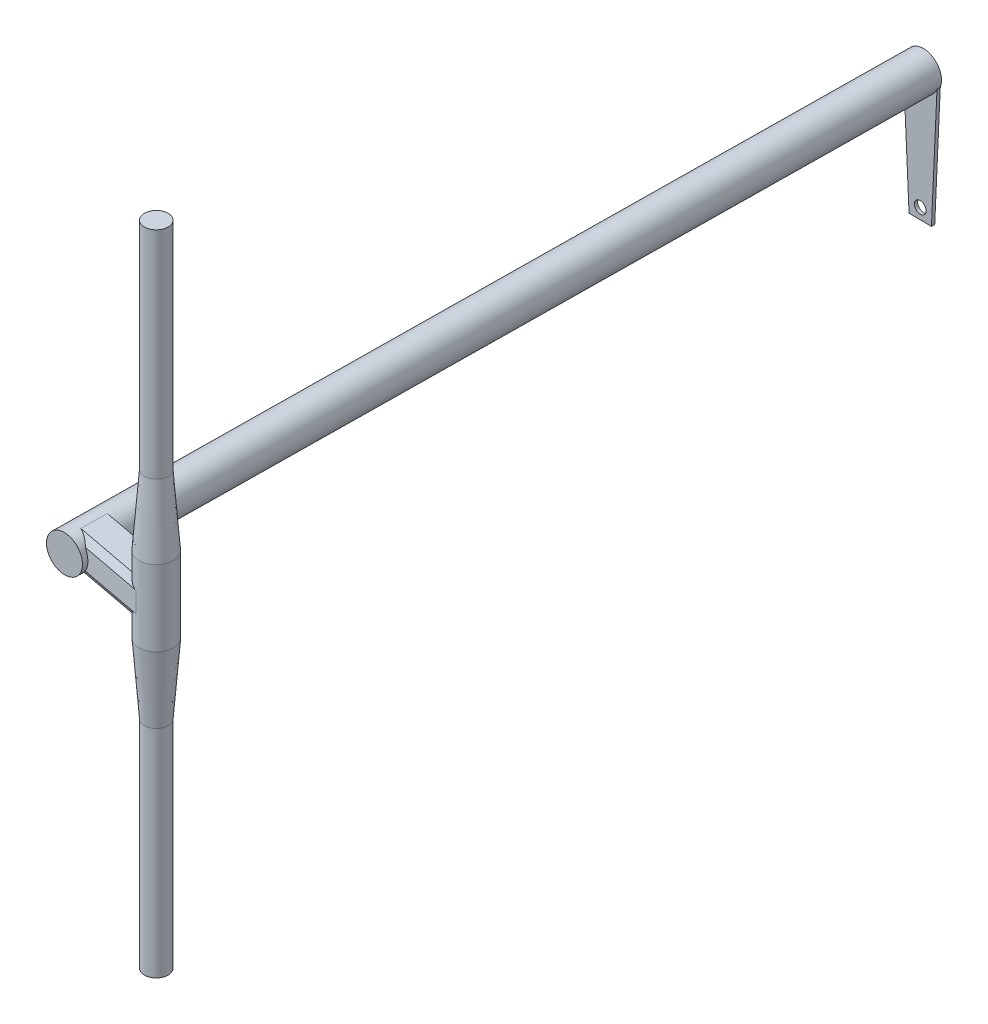
ISO-10303-21;
HEADER;
FILE_DESCRIPTION(('STEP AP214'),'2;1');
FILE_NAME('part.step','',(''),(''),'','','');
FILE_SCHEMA(('AUTOMOTIVE_DESIGN { 1 0 10303 214 1 1 1 1 }'));
ENDSEC;
DATA;
#1=APPLICATION_CONTEXT('core data for automotive mechanical design processes');
#2=APPLICATION_PROTOCOL_DEFINITION('international standard','automotive_design',2000,#1);
#3=PRODUCT_CONTEXT('',#1,'mechanical');
#4=PRODUCT('Part','Part','',(#3));
#5=PRODUCT_RELATED_PRODUCT_CATEGORY('part','',(#4));
#6=PRODUCT_DEFINITION_FORMATION('','',#4);
#7=PRODUCT_DEFINITION_CONTEXT('part definition',#1,'design');
#8=PRODUCT_DEFINITION('design','',#6,#7);
#9=PRODUCT_DEFINITION_SHAPE('','',#8);
#10=(LENGTH_UNIT() NAMED_UNIT(*) SI_UNIT(.MILLI.,.METRE.));
#11=(NAMED_UNIT(*) PLANE_ANGLE_UNIT() SI_UNIT($,.RADIAN.));
#12=(NAMED_UNIT(*) SI_UNIT($,.STERADIAN.) SOLID_ANGLE_UNIT());
#13=UNCERTAINTY_MEASURE_WITH_UNIT(LENGTH_MEASURE(1.E-05),#10,'distance_accuracy_value','');
#14=(GEOMETRIC_REPRESENTATION_CONTEXT(3) GLOBAL_UNCERTAINTY_ASSIGNED_CONTEXT((#13)) GLOBAL_UNIT_ASSIGNED_CONTEXT((#10,
#11,#12)) REPRESENTATION_CONTEXT('',''));
#15=CARTESIAN_POINT('',(0.,0.,0.));
#16=DIRECTION('',(0.,0.,1.));
#17=DIRECTION('',(1.,0.,0.));
#18=AXIS2_PLACEMENT_3D('',#15,#16,#17);
#19=CARTESIAN_POINT('',(-8.79567230162609,0.,724.946643656457));
#20=DIRECTION('',(0.0121319617953464,0.,-0.999926405043389));
#21=DIRECTION('',(-0.999926405043389,0.,-0.0121319617953465));
#22=AXIS2_PLACEMENT_3D('',#19,#20,#21);
#23=CYLINDRICAL_SURFACE('',#22,16.9);
#24=CARTESIAN_POINT('',(0.740049669516222,0.,-60.9955107076468));
#25=DIRECTION('',(0.0121319617953463,0.,-0.999926405043389));
#26=DIRECTION('',(-0.999926405043389,0.,-0.0121319617953463));
#27=AXIS2_PLACEMENT_3D('',#24,#25,#26);
#28=CIRCLE('',#27,16.9);
#29=CARTESIAN_POINT('',(-14.9711540024849,-6.22348315051543,-61.1861324591539));
#30=VERTEX_POINT('',#29);
#31=CARTESIAN_POINT('',(16.4512533415172,-6.22348315051599,-60.8048889561396));
#32=VERTEX_POINT('',#31);
#33=EDGE_CURVE('E218',#30,#32,#28,.T.);
#34=ORIENTED_EDGE('',*,*,#33,.F.);
#35=DIRECTION('',(0.0121319617953464,0.,-0.999926405043389));
#36=VECTOR('',#35,1.);
#37=CARTESIAN_POINT('',(-24.5068759736271,-6.22348315051575,724.75602190495));
#38=LINE('',#37,#36);
#39=CARTESIAN_POINT('',(-15.007549887871,-6.22348315051544,-58.1863532440237));
#40=VERTEX_POINT('',#39);
#41=EDGE_CURVE('E184',#30,#40,#38,.F.);
#42=ORIENTED_EDGE('',*,*,#41,.T.);
#43=CARTESIAN_POINT('',(0.703653784130183,0.,-57.9957314925166));
#44=DIRECTION('',(0.0121319617953463,0.,-0.999926405043389));
#45=DIRECTION('',(-0.999926405043389,0.,-0.0121319617953464));
#46=AXIS2_PLACEMENT_3D('',#43,#44,#45);
#47=CIRCLE('',#46,16.9);
#48=CARTESIAN_POINT('',(16.4148574561311,-6.223483150516,-57.8051097410094));
#49=VERTEX_POINT('',#48);
#50=EDGE_CURVE('E233',#49,#40,#47,.T.);
#51=ORIENTED_EDGE('',*,*,#50,.F.);
#52=DIRECTION('',(0.0121319617953464,0.,-0.999926405043389));
#53=VECTOR('',#52,1.);
#54=CARTESIAN_POINT('',(6.91553137037498,-6.22348315051569,725.137265407964));
#55=LINE('',#54,#53);
#56=EDGE_CURVE('E155',#49,#32,#55,.T.);
#57=ORIENTED_EDGE('',*,*,#56,.T.);
#58=EDGE_LOOP('',(#34,#42,#51,#57));
#59=FACE_BOUND('',#58,.T.);
#60=DIRECTION('',(0.0121319617953464,0.,-0.999926405043389));
#61=VECTOR('',#60,1.);
#62=CARTESIAN_POINT('',(-5.14080792450899,16.5,724.990987594938));
#63=LINE('',#62,#61);
#64=CARTESIAN_POINT('',(-5.00342810130972,16.5,713.668028039474));
#65=VERTEX_POINT('',#64);
#66=CARTESIAN_POINT('',(-4.708790597851,16.5,689.38375937837));
#67=VERTEX_POINT('',#66);
#68=EDGE_CURVE('E224',#65,#67,#63,.T.);
#69=ORIENTED_EDGE('',*,*,#68,.T.);
#70=CARTESIAN_POINT('',(-8.23848059248754,0.,679.022438483589));
#71=DIRECTION('',(-0.16071963414222,-0.500000000000007,0.850981315424248));
#72=DIRECTION('',(-0.239292476715524,-0.816727178648459,-0.525067449233219));
#73=AXIS2_PLACEMENT_3D('',#70,#71,#72);
#74=ELLIPSE('',#73,19.8154807767517,16.9);
#75=CARTESIAN_POINT('',(5.64014694284135,9.50000000000011,687.22540112607));
#76=VERTEX_POINT('',#75);
#77=EDGE_CURVE('E254',#67,#76,#74,.F.);
#78=ORIENTED_EDGE('',*,*,#77,.T.);
#79=CARTESIAN_POINT('',(-8.30604882413043,0.,684.591468464192));
#80=DIRECTION('',(0.185583048072138,0.,-0.982628583071068));
#81=DIRECTION('',(-0.982628583071068,0.,-0.185583048072138));
#82=AXIS2_PLACEMENT_3D('',#79,#80,#81);
#83=ELLIPSE('',#82,17.1607097408691,16.9);
#84=CARTESIAN_POINT('',(5.64014694284137,-9.50000000000009,687.22540112607));
#85=VERTEX_POINT('',#84);
#86=EDGE_CURVE('E221',#76,#85,#83,.T.);
#87=ORIENTED_EDGE('',*,*,#86,.T.);
#88=CARTESIAN_POINT('',(-8.23848059248754,0.,679.022438483589));
#89=DIRECTION('',(-0.16071963414222,0.500000000000007,0.850981315424248));
#90=DIRECTION('',(-0.239292476715524,0.816727178648459,-0.525067449233219));
#91=AXIS2_PLACEMENT_3D('',#88,#89,#90);
#92=ELLIPSE('',#91,19.8154807767517,16.9);
#93=CARTESIAN_POINT('',(-4.70879059785085,-16.5,689.38375937837));
#94=VERTEX_POINT('',#93);
#95=EDGE_CURVE('E258',#85,#94,#92,.F.);
#96=ORIENTED_EDGE('',*,*,#95,.T.);
#97=DIRECTION('',(0.0121319617953464,0.,-0.999926405043389));
#98=VECTOR('',#97,1.);
#99=CARTESIAN_POINT('',(-5.14080792450884,-16.5,724.990987594938));
#100=LINE('',#99,#98);
#101=CARTESIAN_POINT('',(-5.00342810130957,-16.5,713.668028039474));
#102=VERTEX_POINT('',#101);
#103=EDGE_CURVE('E230',#94,#102,#100,.F.);
#104=ORIENTED_EDGE('',*,*,#103,.T.);
#105=CARTESIAN_POINT('',(-8.76782879533736,0.,722.651758656262));
#106=DIRECTION('',(0.16071963414222,0.500000000000004,-0.85098131542425));
#107=DIRECTION('',(-0.239292476715526,-0.81672717864846,-0.525067449233216));
#108=AXIS2_PLACEMENT_3D('',#105,#106,#107);
#109=ELLIPSE('',#108,19.8154807767517,16.9);
#110=CARTESIAN_POINT('',(5.24593520327712,-9.50000000000042,719.716661337536));
#111=VERTEX_POINT('',#110);
#112=EDGE_CURVE('E67',#102,#111,#109,.F.);
#113=ORIENTED_EDGE('',*,*,#112,.T.);
#114=CARTESIAN_POINT('',(-8.70026056369447,0.,717.082728675658));
#115=DIRECTION('',(-0.185583048072138,0.,0.982628583071068));
#116=DIRECTION('',(-0.982628583071068,0.,-0.185583048072138));
#117=AXIS2_PLACEMENT_3D('',#114,#115,#116);
#118=ELLIPSE('',#117,17.1607097408691,16.9);
#119=CARTESIAN_POINT('',(5.24593520327709,9.50000000000046,719.716661337536));
#120=VERTEX_POINT('',#119);
#121=EDGE_CURVE('E227',#111,#120,#118,.T.);
#122=ORIENTED_EDGE('',*,*,#121,.T.);
#123=CARTESIAN_POINT('',(-8.76782879533736,0.,722.651758656262));
#124=DIRECTION('',(0.16071963414222,-0.500000000000004,-0.85098131542425));
#125=DIRECTION('',(-0.239292476715526,0.81672717864846,-0.525067449233216));
#126=AXIS2_PLACEMENT_3D('',#123,#124,#125);
#127=ELLIPSE('',#126,19.8154807767517,16.9);
#128=EDGE_CURVE('E262',#120,#65,#127,.F.);
#129=ORIENTED_EDGE('',*,*,#128,.T.);
#130=EDGE_LOOP('',(#69,#78,#87,#96,#104,#113,#122,#129));
#131=FACE_BOUND('',#130,.T.);
#132=CARTESIAN_POINT('',(-8.79567230162609,0.,724.946643656457));
#133=DIRECTION('',(-0.0121319617953462,0.,0.999926405043389));
#134=DIRECTION('',(0.999926405043389,0.,0.0121319617953462));
#135=AXIS2_PLACEMENT_3D('',#132,#133,#134);
#136=CIRCLE('',#135,16.9);
#137=CARTESIAN_POINT('',(8.1030839436072,0.,725.151673810799));
#138=VERTEX_POINT('',#137);
#139=EDGE_CURVE('E213',#138,#138,#136,.T.);
#140=ORIENTED_EDGE('',*,*,#139,.F.);
#141=EDGE_LOOP('',(#140));
#142=FACE_BOUND('',#141,.T.);
#143=ADVANCED_FACE('F58',(#59,#131,#142),#23,.T.);
#144=CARTESIAN_POINT('',(-8.79567230172777,-4.28049522910312E-12,724.946643656456));
#145=DIRECTION('',(0.0121319617954866,0.,-0.999926405043388));
#146=DIRECTION('',(-0.999926405043388,0.,-0.0121319617954866));
#147=AXIS2_PLACEMENT_3D('',#144,#145,#146);
#148=PLANE('',#147);
#149=ORIENTED_EDGE('',*,*,#139,.T.);
#150=EDGE_LOOP('',(#149));
#151=FACE_BOUND('',#150,.T.);
#152=ADVANCED_FACE('F305',(#151),#148,.F.);
#153=CARTESIAN_POINT('',(0.740049669516125,0.,-60.9955107076468));
#154=DIRECTION('',(0.0121319617953463,0.,-0.999926405043389));
#155=DIRECTION('',(-0.999926405043389,0.,-0.0121319617953463));
#156=AXIS2_PLACEMENT_3D('',#153,#154,#155);
#157=PLANE('',#156);
#158=ORIENTED_EDGE('',*,*,#33,.T.);
#159=DIRECTION('',(-0.0461658037438821,-0.998933633845071,-0.00056012298949935));
#160=VECTOR('',#159,1.);
#161=CARTESIAN_POINT('',(16.7388721502104,0.,-60.8013993189212));
#162=LINE('',#161,#160);
#163=CARTESIAN_POINT('',(11.2392769224717,-119.,-60.8681251087956));
#164=VERTEX_POINT('',#163);
#165=EDGE_CURVE('E177',#32,#164,#162,.T.);
#166=ORIENTED_EDGE('',*,*,#165,.T.);
#167=DIRECTION('',(-0.999926405043389,0.,-0.0121319617953463));
#168=VECTOR('',#167,1.);
#169=CARTESIAN_POINT('',(11.2392769224717,-119.,-60.8681251087956));
#170=LINE('',#169,#168);
#171=CARTESIAN_POINT('',(-9.75917758343947,-119.,-61.1228963064979));
#172=VERTEX_POINT('',#171);
#173=EDGE_CURVE('E167',#164,#172,#170,.T.);
#174=ORIENTED_EDGE('',*,*,#173,.T.);
#175=DIRECTION('',(-0.0461658037438821,0.998933633845071,-0.00056012298949935));
#176=VECTOR('',#175,1.);
#177=CARTESIAN_POINT('',(-9.75917758343947,-119.,-61.1228963064979));
#178=LINE('',#177,#176);
#179=EDGE_CURVE('E160',#172,#30,#178,.T.);
#180=ORIENTED_EDGE('',*,*,#179,.T.);
#181=EDGE_LOOP('',(#158,#166,#174,#180));
#182=FACE_BOUND('',#181,.T.);
#183=CARTESIAN_POINT('',(0.740049669516024,-109.,-60.9955107076468));
#184=DIRECTION('',(0.0121319617953463,0.,-0.999926405043389));
#185=DIRECTION('',(0.,1.,0.));
#186=AXIS2_PLACEMENT_3D('',#183,#184,#185);
#187=ELLIPSE('',#186,5.50000000000001,5.49959522773864);
#188=CARTESIAN_POINT('',(0.740049669516024,-103.5,-60.9955107076468));
#189=VERTEX_POINT('',#188);
#190=EDGE_CURVE('E350',#189,#189,#187,.T.);
#191=ORIENTED_EDGE('',*,*,#190,.F.);
#192=EDGE_LOOP('',(#191));
#193=FACE_BOUND('',#192,.T.);
#194=ADVANCED_FACE('F313',(#182,#193),#157,.T.);
#195=CARTESIAN_POINT('',(81.6028370847578,-16.5,734.137722190684));
#196=DIRECTION('',(0.,-1.,0.));
#197=DIRECTION('',(0.,0.,-1.));
#198=AXIS2_PLACEMENT_3D('',#195,#196,#197);
#199=PLANE('',#198);
#200=ORIENTED_EDGE('',*,*,#103,.F.);
#201=DIRECTION('',(0.982628583071068,0.,0.185583048072138));
#202=VECTOR('',#201,1.);
#203=CARTESIAN_POINT('',(86.7914696637359,-16.5,706.664853671056));
#204=LINE('',#203,#202);
#205=CARTESIAN_POINT('',(57.9784640597501,-16.5,701.223117600856));
#206=VERTEX_POINT('',#205);
#207=EDGE_CURVE('E248',#94,#206,#204,.T.);
#208=ORIENTED_EDGE('',*,*,#207,.T.);
#209=CARTESIAN_POINT('',(66.2043276983739,-16.5,714.946643656457));
#210=DIRECTION('',(0.,-1.,0.));
#211=DIRECTION('',(0.,0.,-1.));
#212=AXIS2_PLACEMENT_3D('',#209,#210,#211);
#213=CIRCLE('',#212,16.);
#214=CARTESIAN_POINT('',(53.5398564401023,-16.5,724.724739981837));
#215=VERTEX_POINT('',#214);
#216=EDGE_CURVE('E205',#215,#206,#213,.T.);
#217=ORIENTED_EDGE('',*,*,#216,.F.);
#218=DIRECTION('',(-0.982628583071068,0.,-0.185583048072138));
#219=VECTOR('',#218,1.);
#220=CARTESIAN_POINT('',(82.3528620440881,-16.5,730.166476052037));
#221=LINE('',#220,#219);
#222=EDGE_CURVE('E245',#215,#102,#221,.T.);
#223=ORIENTED_EDGE('',*,*,#222,.T.);
#224=EDGE_LOOP('',(#200,#208,#217,#223));
#225=FACE_BOUND('',#224,.T.);
#226=ADVANCED_FACE('F276',(#225),#199,.T.);
#227=CARTESIAN_POINT('',(81.6028370847578,16.5,734.137722190684));
#228=DIRECTION('',(0.,1.,0.));
#229=DIRECTION('',(0.,0.,1.));
#230=AXIS2_PLACEMENT_3D('',#227,#228,#229);
#231=PLANE('',#230);
#232=CARTESIAN_POINT('',(66.2043276983739,16.5,714.946643656457));
#233=DIRECTION('',(0.,1.,0.));
#234=DIRECTION('',(0.,0.,1.));
#235=AXIS2_PLACEMENT_3D('',#232,#233,#234);
#236=CIRCLE('',#235,16.);
#237=CARTESIAN_POINT('',(57.9784640597501,16.5,701.223117600856));
#238=VERTEX_POINT('',#237);
#239=CARTESIAN_POINT('',(53.5398564401023,16.5,724.724739981837));
#240=VERTEX_POINT('',#239);
#241=EDGE_CURVE('E208',#238,#240,#236,.T.);
#242=ORIENTED_EDGE('',*,*,#241,.F.);
#243=DIRECTION('',(-0.982628583071068,0.,-0.185583048072138));
#244=VECTOR('',#243,1.);
#245=CARTESIAN_POINT('',(86.7914696637359,16.5,706.664853671056));
#246=LINE('',#245,#244);
#247=EDGE_CURVE('E237',#238,#67,#246,.T.);
#248=ORIENTED_EDGE('',*,*,#247,.T.);
#249=ORIENTED_EDGE('',*,*,#68,.F.);
#250=DIRECTION('',(0.982628583071068,0.,0.185583048072138));
#251=VECTOR('',#250,1.);
#252=CARTESIAN_POINT('',(82.3528620440881,16.5,730.166476052037));
#253=LINE('',#252,#251);
#254=EDGE_CURVE('E235',#65,#240,#253,.T.);
#255=ORIENTED_EDGE('',*,*,#254,.T.);
#256=EDGE_LOOP('',(#242,#248,#249,#255));
#257=FACE_BOUND('',#256,.T.);
#258=ADVANCED_FACE('F292',(#257),#231,.T.);
#259=CARTESIAN_POINT('',(81.6028370847578,16.5,734.137722190684));
#260=DIRECTION('',(-0.185583048072138,0.,0.982628583071068));
#261=DIRECTION('',(0.982628583071068,0.,0.185583048072138));
#262=AXIS2_PLACEMENT_3D('',#259,#260,#261);
#263=PLANE('',#262);
#264=DIRECTION('',(0.,1.,0.));
#265=VECTOR('',#264,1.);
#266=CARTESIAN_POINT('',(63.2349989292197,300.,730.668700985594));
#267=LINE('',#266,#265);
#268=CARTESIAN_POINT('',(63.2349989292197,-9.5000000000004,730.668700985594));
#269=VERTEX_POINT('',#268);
#270=CARTESIAN_POINT('',(63.2349989292197,9.50000000000045,730.668700985594));
#271=VERTEX_POINT('',#270);
#272=EDGE_CURVE('E206',#269,#271,#267,.T.);
#273=ORIENTED_EDGE('',*,*,#272,.T.);
#274=DIRECTION('',(-0.982628583071068,0.,-0.185583048072138));
#275=VECTOR('',#274,1.);
#276=CARTESIAN_POINT('',(81.6028370847578,9.50000000000046,734.137722190684));
#277=LINE('',#276,#275);
#278=EDGE_CURVE('E251',#271,#120,#277,.T.);
#279=ORIENTED_EDGE('',*,*,#278,.T.);
#280=ORIENTED_EDGE('',*,*,#121,.F.);
#281=DIRECTION('',(0.982628583071068,0.,0.185583048072138));
#282=VECTOR('',#281,1.);
#283=CARTESIAN_POINT('',(81.6028370847578,-9.50000000000042,734.137722190684));
#284=LINE('',#283,#282);
#285=EDGE_CURVE('E81',#111,#269,#284,.T.);
#286=ORIENTED_EDGE('',*,*,#285,.T.);
#287=EDGE_LOOP('',(#273,#279,#280,#286));
#288=FACE_BOUND('',#287,.T.);
#289=ADVANCED_FACE('F269',(#288),#263,.T.);
#290=CARTESIAN_POINT('',(87.5414946230662,16.5,702.693607532409));
#291=DIRECTION('',(0.185583048072138,0.,-0.982628583071068));
#292=DIRECTION('',(-0.982628583071068,0.,-0.185583048072138));
#293=AXIS2_PLACEMENT_3D('',#290,#291,#292);
#294=PLANE('',#293);
#295=ORIENTED_EDGE('',*,*,#86,.F.);
#296=DIRECTION('',(0.982628583071068,0.,0.185583048072138));
#297=VECTOR('',#296,1.);
#298=CARTESIAN_POINT('',(87.5414946230662,9.50000000000012,702.693607532409));
#299=LINE('',#298,#297);
#300=CARTESIAN_POINT('',(69.1736564675281,9.50000000000012,699.22458632732));
#301=VERTEX_POINT('',#300);
#302=EDGE_CURVE('E243',#76,#301,#299,.T.);
#303=ORIENTED_EDGE('',*,*,#302,.T.);
#304=DIRECTION('',(0.,1.,0.));
#305=VECTOR('',#304,1.);
#306=CARTESIAN_POINT('',(69.1736564675281,300.,699.22458632732));
#307=LINE('',#306,#305);
#308=CARTESIAN_POINT('',(69.1736564675281,-9.50000000000012,699.22458632732));
#309=VERTEX_POINT('',#308);
#310=EDGE_CURVE('E210',#309,#301,#307,.T.);
#311=ORIENTED_EDGE('',*,*,#310,.F.);
#312=DIRECTION('',(-0.982628583071068,0.,-0.185583048072138));
#313=VECTOR('',#312,1.);
#314=CARTESIAN_POINT('',(87.5414946230662,-9.5000000000001,702.693607532409));
#315=LINE('',#314,#313);
#316=EDGE_CURVE('E240',#309,#85,#315,.T.);
#317=ORIENTED_EDGE('',*,*,#316,.T.);
#318=EDGE_LOOP('',(#295,#303,#311,#317));
#319=FACE_BOUND('',#318,.T.);
#320=ADVANCED_FACE('F285',(#319),#294,.T.);
#321=CARTESIAN_POINT('',(66.2043276983739,300.,714.946643656457));
#322=DIRECTION('',(0.,1.,0.));
#323=DIRECTION('',(-1.,0.,0.));
#324=AXIS2_PLACEMENT_3D('',#321,#322,#323);
#325=CYLINDRICAL_SURFACE('',#324,16.);
#326=CARTESIAN_POINT('',(66.2043276983739,34.9999999999996,714.946643656457));
#327=DIRECTION('',(0.,1.,0.));
#328=DIRECTION('',(-1.,0.,0.));
#329=AXIS2_PLACEMENT_3D('',#326,#327,#328);
#330=CIRCLE('',#329,16.);
#331=CARTESIAN_POINT('',(50.2043276983738,34.9999999999996,714.946643656457));
#332=VERTEX_POINT('',#331);
#333=EDGE_CURVE('E193',#332,#332,#330,.T.);
#334=ORIENTED_EDGE('',*,*,#333,.F.);
#335=EDGE_LOOP('',(#334));
#336=FACE_BOUND('',#335,.T.);
#337=CARTESIAN_POINT('',(66.2043276983739,-34.9999999999996,714.946643656457));
#338=DIRECTION('',(0.,1.,0.));
#339=DIRECTION('',(-1.,0.,0.));
#340=AXIS2_PLACEMENT_3D('',#337,#338,#339);
#341=CIRCLE('',#340,15.9999999999999);
#342=CARTESIAN_POINT('',(50.2043276983739,-34.9999999999996,714.946643656457));
#343=VERTEX_POINT('',#342);
#344=EDGE_CURVE('E196',#343,#343,#341,.T.);
#345=ORIENTED_EDGE('',*,*,#344,.T.);
#346=EDGE_LOOP('',(#345));
#347=FACE_BOUND('',#346,.T.);
#348=ORIENTED_EDGE('',*,*,#272,.F.);
#349=CARTESIAN_POINT('',(66.2043276983739,-37.212812921102,714.946643656457));
#350=DIRECTION('',(0.16071963414222,0.500000000000004,-0.85098131542425));
#351=DIRECTION('',(-0.0927915240360698,0.866025403784437,0.491314291535538));
#352=AXIS2_PLACEMENT_3D('',#349,#350,#351);
#353=ELLIPSE('',#352,31.9999999999997,16.);
#354=EDGE_CURVE('E12',#269,#215,#353,.F.);
#355=ORIENTED_EDGE('',*,*,#354,.T.);
#356=ORIENTED_EDGE('',*,*,#216,.T.);
#357=CARTESIAN_POINT('',(66.2043276983739,-37.212812921102,714.946643656457));
#358=DIRECTION('',(-0.16071963414222,0.500000000000007,0.850981315424248));
#359=DIRECTION('',(0.0927915240360706,0.866025403784435,-0.491314291535541));
#360=AXIS2_PLACEMENT_3D('',#357,#358,#359);
#361=ELLIPSE('',#360,31.9999999999995,16.);
#362=EDGE_CURVE('E260',#206,#309,#361,.F.);
#363=ORIENTED_EDGE('',*,*,#362,.T.);
#364=ORIENTED_EDGE('',*,*,#310,.T.);
#365=CARTESIAN_POINT('',(66.2043276983739,37.2128129211019,714.946643656457));
#366=DIRECTION('',(-0.16071963414222,-0.500000000000007,0.850981315424248));
#367=DIRECTION('',(-0.0927915240360704,0.866025403784435,0.491314291535541));
#368=AXIS2_PLACEMENT_3D('',#365,#366,#367);
#369=ELLIPSE('',#368,31.9999999999995,16.);
#370=EDGE_CURVE('E256',#301,#238,#369,.F.);
#371=ORIENTED_EDGE('',*,*,#370,.T.);
#372=ORIENTED_EDGE('',*,*,#241,.T.);
#373=CARTESIAN_POINT('',(66.2043276983739,37.2128129211021,714.946643656457));
#374=DIRECTION('',(0.16071963414222,-0.500000000000004,-0.85098131542425));
#375=DIRECTION('',(0.09279152403607,0.866025403784437,-0.491314291535538));
#376=AXIS2_PLACEMENT_3D('',#373,#374,#375);
#377=ELLIPSE('',#376,31.9999999999997,16.);
#378=EDGE_CURVE('E74',#240,#271,#377,.F.);
#379=ORIENTED_EDGE('',*,*,#378,.T.);
#380=EDGE_LOOP('',(#348,#355,#356,#363,#364,#371,#372,#379));
#381=FACE_BOUND('',#380,.T.);
#382=ADVANCED_FACE('F273',(#336,#347,#381),#325,.T.);
#383=CARTESIAN_POINT('',(55.204327698374,300.,714.946643656457));
#384=DIRECTION('',(0.,1.,0.));
#385=DIRECTION('',(-1.,0.,0.));
#386=AXIS2_PLACEMENT_3D('',#383,#384,#385);
#387=PLANE('',#386);
#388=CARTESIAN_POINT('',(66.2043276983739,300.,714.946643656457));
#389=DIRECTION('',(0.,1.,0.));
#390=DIRECTION('',(-1.,0.,0.));
#391=AXIS2_PLACEMENT_3D('',#388,#389,#390);
#392=CIRCLE('',#391,10.9999999999999);
#393=CARTESIAN_POINT('',(55.204327698374,300.,714.946643656457));
#394=VERTEX_POINT('',#393);
#395=EDGE_CURVE('E187',#394,#394,#392,.T.);
#396=ORIENTED_EDGE('',*,*,#395,.T.);
#397=EDGE_LOOP('',(#396));
#398=FACE_BOUND('',#397,.T.);
#399=ADVANCED_FACE('F372',(#398),#387,.T.);
#400=CARTESIAN_POINT('',(66.2043276983738,-300.,714.946643656457));
#401=DIRECTION('',(0.,-1.,0.));
#402=DIRECTION('',(1.,0.,0.));
#403=AXIS2_PLACEMENT_3D('',#400,#401,#402);
#404=PLANE('',#403);
#405=CARTESIAN_POINT('',(66.2043276983738,-300.,714.946643656457));
#406=DIRECTION('',(0.,1.,0.));
#407=DIRECTION('',(-1.,0.,0.));
#408=AXIS2_PLACEMENT_3D('',#405,#406,#407);
#409=CIRCLE('',#408,11.);
#410=CARTESIAN_POINT('',(55.2043276983738,-300.,714.946643656457));
#411=VERTEX_POINT('',#410);
#412=EDGE_CURVE('E202',#411,#411,#409,.T.);
#413=ORIENTED_EDGE('',*,*,#412,.F.);
#414=EDGE_LOOP('',(#413));
#415=FACE_BOUND('',#414,.T.);
#416=ADVANCED_FACE('F380',(#415),#404,.T.);
#417=CARTESIAN_POINT('',(66.2043276983739,300.,714.946643656457));
#418=DIRECTION('',(0.,1.,0.));
#419=DIRECTION('',(-1.,0.,0.));
#420=AXIS2_PLACEMENT_3D('',#417,#418,#419);
#421=CYLINDRICAL_SURFACE('',#420,11.);
#422=ORIENTED_EDGE('',*,*,#412,.T.);
#423=EDGE_LOOP('',(#422));
#424=FACE_BOUND('',#423,.T.);
#425=CARTESIAN_POINT('',(66.2043276983738,-100.,714.946643656457));
#426=DIRECTION('',(0.,1.,0.));
#427=DIRECTION('',(-1.,0.,0.));
#428=AXIS2_PLACEMENT_3D('',#425,#426,#427);
#429=CIRCLE('',#428,11.);
#430=CARTESIAN_POINT('',(55.2043276983738,-100.,714.946643656457));
#431=VERTEX_POINT('',#430);
#432=EDGE_CURVE('E199',#431,#431,#429,.T.);
#433=ORIENTED_EDGE('',*,*,#432,.F.);
#434=EDGE_LOOP('',(#433));
#435=FACE_BOUND('',#434,.T.);
#436=ADVANCED_FACE('F376',(#424,#435),#421,.T.);
#437=CARTESIAN_POINT('',(66.2043276983739,-34.9999999999996,714.946643656457));
#438=DIRECTION('',(0.,1.,0.));
#439=DIRECTION('',(-1.,0.,0.));
#440=AXIS2_PLACEMENT_3D('',#437,#438,#439);
#441=CONICAL_SURFACE('',#440,15.9999999999999,0.0767718912697761);
#442=ORIENTED_EDGE('',*,*,#432,.T.);
#443=EDGE_LOOP('',(#442));
#444=FACE_BOUND('',#443,.T.);
#445=ORIENTED_EDGE('',*,*,#344,.F.);
#446=EDGE_LOOP('',(#445));
#447=FACE_BOUND('',#446,.T.);
#448=ADVANCED_FACE('F369',(#444,#447),#441,.T.);
#449=CARTESIAN_POINT('',(66.2043276983739,100.,714.946643656457));
#450=DIRECTION('',(0.,-1.,0.));
#451=DIRECTION('',(1.,0.,0.));
#452=AXIS2_PLACEMENT_3D('',#449,#450,#451);
#453=CONICAL_SURFACE('',#452,10.9999999999999,0.0767718912697794);
#454=ORIENTED_EDGE('',*,*,#333,.T.);
#455=EDGE_LOOP('',(#454));
#456=FACE_BOUND('',#455,.T.);
#457=CARTESIAN_POINT('',(66.2043276983739,100.,714.946643656457));
#458=DIRECTION('',(0.,1.,0.));
#459=DIRECTION('',(-1.,0.,0.));
#460=AXIS2_PLACEMENT_3D('',#457,#458,#459);
#461=CIRCLE('',#460,10.9999999999999);
#462=CARTESIAN_POINT('',(55.204327698374,100.,714.946643656457));
#463=VERTEX_POINT('',#462);
#464=EDGE_CURVE('E190',#463,#463,#461,.T.);
#465=ORIENTED_EDGE('',*,*,#464,.F.);
#466=EDGE_LOOP('',(#465));
#467=FACE_BOUND('',#466,.T.);
#468=ADVANCED_FACE('F365',(#456,#467),#453,.T.);
#469=CARTESIAN_POINT('',(66.2043276983739,300.,714.946643656457));
#470=DIRECTION('',(0.,1.,0.));
#471=DIRECTION('',(-1.,0.,0.));
#472=AXIS2_PLACEMENT_3D('',#469,#470,#471);
#473=CYLINDRICAL_SURFACE('',#472,10.9999999999999);
#474=ORIENTED_EDGE('',*,*,#464,.T.);
#475=EDGE_LOOP('',(#474));
#476=FACE_BOUND('',#475,.T.);
#477=ORIENTED_EDGE('',*,*,#395,.F.);
#478=EDGE_LOOP('',(#477));
#479=FACE_BOUND('',#478,.T.);
#480=ADVANCED_FACE('F357',(#476,#479),#473,.T.);
#481=CARTESIAN_POINT('',(-9.7955734688255,-119.,-58.1231170913677));
#482=DIRECTION('',(-0.998860117367631,-0.046169201564268,-0.0121190246818949));
#483=DIRECTION('',(0.0461725923906261,-0.998933477120438,0.));
#484=AXIS2_PLACEMENT_3D('',#481,#482,#483);
#485=PLANE('',#484);
#486=ORIENTED_EDGE('',*,*,#41,.F.);
#487=ORIENTED_EDGE('',*,*,#179,.F.);
#488=DIRECTION('',(0.0121319617953463,0.,-0.999926405043389));
#489=VECTOR('',#488,1.);
#490=CARTESIAN_POINT('',(-9.7955734688255,-119.,-58.1231170913677));
#491=LINE('',#490,#489);
#492=CARTESIAN_POINT('',(-9.7955734688255,-119.,-58.1231170913677));
#493=VERTEX_POINT('',#492);
#494=EDGE_CURVE('E168',#493,#172,#491,.T.);
#495=ORIENTED_EDGE('',*,*,#494,.F.);
#496=DIRECTION('',(-0.0461658037438821,0.998933633845071,-0.00056012298949935));
#497=VECTOR('',#496,1.);
#498=CARTESIAN_POINT('',(-9.7955734688255,-119.,-58.1231170913677));
#499=LINE('',#498,#497);
#500=EDGE_CURVE('E169',#493,#40,#499,.T.);
#501=ORIENTED_EDGE('',*,*,#500,.T.);
#502=EDGE_LOOP('',(#486,#487,#495,#501));
#503=FACE_BOUND('',#502,.T.);
#504=ADVANCED_FACE('F354',(#503),#485,.T.);
#505=CARTESIAN_POINT('',(16.7024762648243,0.,-57.801620103791));
#506=DIRECTION('',(0.998860117367631,-0.046169201564268,0.0121190246818949));
#507=DIRECTION('',(0.0461725923906261,0.998933477120438,0.));
#508=AXIS2_PLACEMENT_3D('',#505,#506,#507);
#509=PLANE('',#508);
#510=ORIENTED_EDGE('',*,*,#56,.F.);
#511=DIRECTION('',(-0.0461658037438821,-0.998933633845071,-0.00056012298949935));
#512=VECTOR('',#511,1.);
#513=CARTESIAN_POINT('',(16.7024762648243,0.,-57.801620103791));
#514=LINE('',#513,#512);
#515=CARTESIAN_POINT('',(11.2028810370857,-119.,-57.8683458936654));
#516=VERTEX_POINT('',#515);
#517=EDGE_CURVE('E149',#49,#516,#514,.T.);
#518=ORIENTED_EDGE('',*,*,#517,.T.);
#519=DIRECTION('',(0.0121319617953463,0.,-0.999926405043389));
#520=VECTOR('',#519,1.);
#521=CARTESIAN_POINT('',(11.2028810370857,-119.,-57.8683458936654));
#522=LINE('',#521,#520);
#523=EDGE_CURVE('E152',#516,#164,#522,.T.);
#524=ORIENTED_EDGE('',*,*,#523,.T.);
#525=ORIENTED_EDGE('',*,*,#165,.F.);
#526=EDGE_LOOP('',(#510,#518,#524,#525));
#527=FACE_BOUND('',#526,.T.);
#528=ADVANCED_FACE('F151',(#527),#509,.T.);
#529=CARTESIAN_POINT('',(11.2028810370857,-119.,-57.8683458936654));
#530=DIRECTION('',(0.,-1.,0.));
#531=DIRECTION('',(0.,0.,-1.));
#532=AXIS2_PLACEMENT_3D('',#529,#530,#531);
#533=PLANE('',#532);
#534=ORIENTED_EDGE('',*,*,#173,.F.);
#535=ORIENTED_EDGE('',*,*,#523,.F.);
#536=DIRECTION('',(-0.999926405043389,0.,-0.0121319617953463));
#537=VECTOR('',#536,1.);
#538=CARTESIAN_POINT('',(11.2028810370857,-119.,-57.8683458936654));
#539=LINE('',#538,#537);
#540=EDGE_CURVE('E159',#516,#493,#539,.T.);
#541=ORIENTED_EDGE('',*,*,#540,.T.);
#542=ORIENTED_EDGE('',*,*,#494,.T.);
#543=EDGE_LOOP('',(#534,#535,#541,#542));
#544=FACE_BOUND('',#543,.T.);
#545=ADVANCED_FACE('F164',(#544),#533,.T.);
#546=CARTESIAN_POINT('',(0.703653784130088,0.,-57.9957314925166));
#547=DIRECTION('',(0.0121319617953463,0.,-0.999926405043389));
#548=DIRECTION('',(-0.999926405043389,0.,-0.0121319617953464));
#549=AXIS2_PLACEMENT_3D('',#546,#547,#548);
#550=PLANE('',#549);
#551=CARTESIAN_POINT('',(0.703653784129984,-109.,-57.9957314925166));
#552=DIRECTION('',(0.0121319617953463,0.,-0.999926405043389));
#553=DIRECTION('',(0.,1.,0.));
#554=AXIS2_PLACEMENT_3D('',#551,#552,#553);
#555=ELLIPSE('',#554,5.50000000000001,5.49959522773864);
#556=CARTESIAN_POINT('',(0.703653784129984,-103.5,-57.9957314925166));
#557=VERTEX_POINT('',#556);
#558=EDGE_CURVE('E179',#557,#557,#555,.T.);
#559=ORIENTED_EDGE('',*,*,#558,.T.);
#560=EDGE_LOOP('',(#559));
#561=FACE_BOUND('',#560,.T.);
#562=ORIENTED_EDGE('',*,*,#517,.F.);
#563=ORIENTED_EDGE('',*,*,#50,.T.);
#564=ORIENTED_EDGE('',*,*,#500,.F.);
#565=ORIENTED_EDGE('',*,*,#540,.F.);
#566=EDGE_LOOP('',(#562,#563,#564,#565));
#567=FACE_BOUND('',#566,.T.);
#568=ADVANCED_FACE('F171',(#561,#567),#550,.F.);
#569=DIRECTION('',(0.0121319617953463,0.,-0.999926405043389));
#570=VECTOR('',#569,1.);
#571=SURFACE_OF_LINEAR_EXTRUSION('',#555,#570);
#572=ORIENTED_EDGE('',*,*,#558,.F.);
#573=EDGE_LOOP('',(#572));
#574=FACE_BOUND('',#573,.T.);
#575=ORIENTED_EDGE('',*,*,#190,.T.);
#576=EDGE_LOOP('',(#575));
#577=FACE_BOUND('',#576,.T.);
#578=ADVANCED_FACE('F327',(#574,#577),#571,.F.);
#579=CARTESIAN_POINT('',(86.7914696637359,16.5,706.664853671056));
#580=DIRECTION('',(-0.16071963414222,-0.500000000000007,0.850981315424248));
#581=DIRECTION('',(-0.982628583071068,0.,-0.185583048072138));
#582=AXIS2_PLACEMENT_3D('',#579,#580,#581);
#583=PLANE('',#582);
#584=ORIENTED_EDGE('',*,*,#370,.F.);
#585=ORIENTED_EDGE('',*,*,#302,.F.);
#586=ORIENTED_EDGE('',*,*,#77,.F.);
#587=ORIENTED_EDGE('',*,*,#247,.F.);
#588=EDGE_LOOP('',(#584,#585,#586,#587));
#589=FACE_BOUND('',#588,.T.);
#590=ADVANCED_FACE('F288',(#589),#583,.F.);
#591=CARTESIAN_POINT('',(87.5414946230662,-9.5000000000001,702.693607532409));
#592=DIRECTION('',(-0.16071963414222,0.500000000000007,0.850981315424248));
#593=DIRECTION('',(-0.982628583071068,0.,-0.185583048072138));
#594=AXIS2_PLACEMENT_3D('',#591,#592,#593);
#595=PLANE('',#594);
#596=ORIENTED_EDGE('',*,*,#362,.F.);
#597=ORIENTED_EDGE('',*,*,#207,.F.);
#598=ORIENTED_EDGE('',*,*,#95,.F.);
#599=ORIENTED_EDGE('',*,*,#316,.F.);
#600=EDGE_LOOP('',(#596,#597,#598,#599));
#601=FACE_BOUND('',#600,.T.);
#602=ADVANCED_FACE('F279',(#601),#595,.F.);
#603=CARTESIAN_POINT('',(81.6028370847578,9.50000000000046,734.137722190684));
#604=DIRECTION('',(0.16071963414222,-0.500000000000004,-0.85098131542425));
#605=DIRECTION('',(-0.982628583071068,0.,-0.185583048072138));
#606=AXIS2_PLACEMENT_3D('',#603,#604,#605);
#607=PLANE('',#606);
#608=ORIENTED_EDGE('',*,*,#378,.F.);
#609=ORIENTED_EDGE('',*,*,#254,.F.);
#610=ORIENTED_EDGE('',*,*,#128,.F.);
#611=ORIENTED_EDGE('',*,*,#278,.F.);
#612=EDGE_LOOP('',(#608,#609,#610,#611));
#613=FACE_BOUND('',#612,.T.);
#614=ADVANCED_FACE('F296',(#613),#607,.F.);
#615=CARTESIAN_POINT('',(82.3528620440881,-16.5,730.166476052037));
#616=DIRECTION('',(0.16071963414222,0.500000000000004,-0.85098131542425));
#617=DIRECTION('',(-0.982628583071068,0.,-0.185583048072138));
#618=AXIS2_PLACEMENT_3D('',#615,#616,#617);
#619=PLANE('',#618);
#620=ORIENTED_EDGE('',*,*,#354,.F.);
#621=ORIENTED_EDGE('',*,*,#285,.F.);
#622=ORIENTED_EDGE('',*,*,#112,.F.);
#623=ORIENTED_EDGE('',*,*,#222,.F.);
#624=EDGE_LOOP('',(#620,#621,#622,#623));
#625=FACE_BOUND('',#624,.T.);
#626=ADVANCED_FACE('F61',(#625),#619,.F.);
#627=CLOSED_SHELL('',(#143,#152,#194,#226,#258,#289,#320,#382,#399,#416,#436,#448,#468,#480,
#504,#528,#545,#568,#578,#590,#602,#614,#626));
#628=MANIFOLD_SOLID_BREP('B2',#627);
#629=ADVANCED_BREP_SHAPE_REPRESENTATION('',(#18,#628),#14);
#630=SHAPE_DEFINITION_REPRESENTATION(#9,#629);
ENDSEC;
END-ISO-10303-21;
